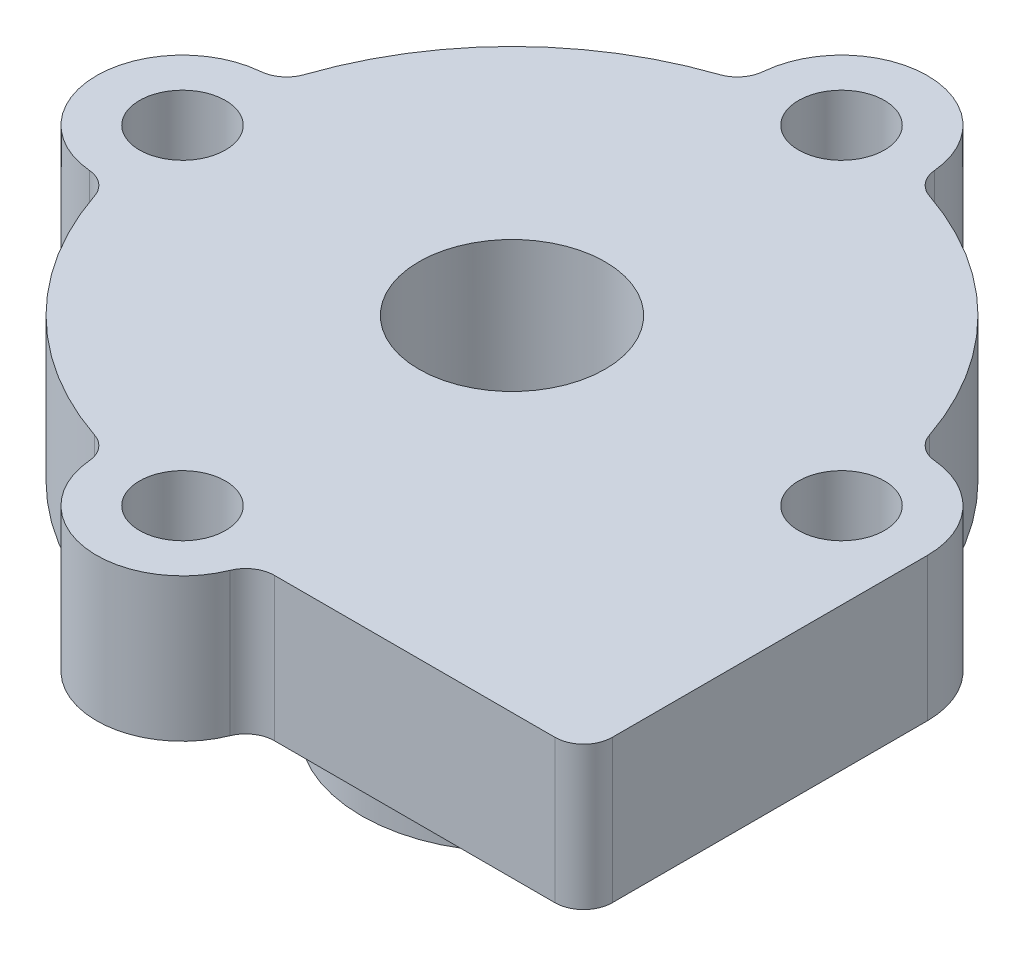
ISO-10303-21;
HEADER;
FILE_DESCRIPTION(('STEP AP214'),'2;1');
FILE_NAME('part.step','',(''),(''),'','','');
FILE_SCHEMA(('AUTOMOTIVE_DESIGN { 1 0 10303 214 1 1 1 1 }'));
ENDSEC;
DATA;
#1=APPLICATION_CONTEXT('core data for automotive mechanical design processes');
#2=APPLICATION_PROTOCOL_DEFINITION('international standard','automotive_design',2000,#1);
#3=PRODUCT_CONTEXT('',#1,'mechanical');
#4=PRODUCT('Part','Part','',(#3));
#5=PRODUCT_RELATED_PRODUCT_CATEGORY('part','',(#4));
#6=PRODUCT_DEFINITION_FORMATION('','',#4);
#7=PRODUCT_DEFINITION_CONTEXT('part definition',#1,'design');
#8=PRODUCT_DEFINITION('design','',#6,#7);
#9=PRODUCT_DEFINITION_SHAPE('','',#8);
#10=(LENGTH_UNIT() NAMED_UNIT(*) SI_UNIT(.MILLI.,.METRE.));
#11=(NAMED_UNIT(*) PLANE_ANGLE_UNIT() SI_UNIT($,.RADIAN.));
#12=(NAMED_UNIT(*) SI_UNIT($,.STERADIAN.) SOLID_ANGLE_UNIT());
#13=UNCERTAINTY_MEASURE_WITH_UNIT(LENGTH_MEASURE(1.E-05),#10,'distance_accuracy_value','');
#14=(GEOMETRIC_REPRESENTATION_CONTEXT(3) GLOBAL_UNCERTAINTY_ASSIGNED_CONTEXT((#13)) GLOBAL_UNIT_ASSIGNED_CONTEXT((#10,
#11,#12)) REPRESENTATION_CONTEXT('',''));
#15=CARTESIAN_POINT('',(0.,0.,0.));
#16=DIRECTION('',(0.,0.,1.));
#17=DIRECTION('',(1.,0.,0.));
#18=AXIS2_PLACEMENT_3D('',#15,#16,#17);
#19=CARTESIAN_POINT('',(0.,0.,0.));
#20=DIRECTION('',(0.,1.,0.));
#21=DIRECTION('',(0.,0.,1.));
#22=AXIS2_PLACEMENT_3D('',#19,#20,#21);
#23=PLANE('',#22);
#24=CARTESIAN_POINT('',(0.,0.,0.));
#25=DIRECTION('',(0.,1.,0.));
#26=DIRECTION('',(0.,0.,1.));
#27=AXIS2_PLACEMENT_3D('',#24,#25,#26);
#28=CIRCLE('',#27,6.25);
#29=CARTESIAN_POINT('',(0.,0.,6.25));
#30=VERTEX_POINT('',#29);
#31=EDGE_CURVE('E233',#30,#30,#28,.T.);
#32=ORIENTED_EDGE('',*,*,#31,.T.);
#33=EDGE_LOOP('',(#32));
#34=FACE_BOUND('',#33,.T.);
#35=CARTESIAN_POINT('',(0.,0.,-11.5));
#36=DIRECTION('',(0.,1.,0.));
#37=DIRECTION('',(0.,0.,1.));
#38=AXIS2_PLACEMENT_3D('',#35,#36,#37);
#39=CIRCLE('',#38,1.5);
#40=CARTESIAN_POINT('',(0.,0.,-10.));
#41=VERTEX_POINT('',#40);
#42=EDGE_CURVE('E194',#41,#41,#39,.T.);
#43=ORIENTED_EDGE('',*,*,#42,.T.);
#44=EDGE_LOOP('',(#43));
#45=FACE_BOUND('',#44,.T.);
#46=DIRECTION('',(0.,0.,-1.));
#47=VECTOR('',#46,1.);
#48=CARTESIAN_POINT('',(14.5,0.,12.));
#49=LINE('',#48,#47);
#50=CARTESIAN_POINT('',(14.5,0.,11.));
#51=VERTEX_POINT('',#50);
#52=CARTESIAN_POINT('',(14.5,0.,0.));
#53=VERTEX_POINT('',#52);
#54=EDGE_CURVE('E153',#51,#53,#49,.T.);
#55=ORIENTED_EDGE('',*,*,#54,.F.);
#56=CARTESIAN_POINT('',(13.5,0.,11.));
#57=DIRECTION('',(0.,1.,0.));
#58=DIRECTION('',(0.,0.,1.));
#59=AXIS2_PLACEMENT_3D('',#56,#57,#58);
#60=CIRCLE('',#59,1.);
#61=CARTESIAN_POINT('',(13.5,0.,12.));
#62=VERTEX_POINT('',#61);
#63=EDGE_CURVE('E231',#51,#62,#60,.F.);
#64=ORIENTED_EDGE('',*,*,#63,.T.);
#65=DIRECTION('',(1.,0.,0.));
#66=VECTOR('',#65,1.);
#67=CARTESIAN_POINT('',(0.,0.,12.));
#68=LINE('',#67,#66);
#69=CARTESIAN_POINT('',(3.70809924354783,0.,12.));
#70=VERTEX_POINT('',#69);
#71=EDGE_CURVE('E163',#70,#62,#68,.T.);
#72=ORIENTED_EDGE('',*,*,#71,.F.);
#73=CARTESIAN_POINT('',(3.70809924354783,0.,13.));
#74=DIRECTION('',(0.,1.,0.));
#75=DIRECTION('',(0.,0.,1.));
#76=AXIS2_PLACEMENT_3D('',#73,#74,#75);
#77=CIRCLE('',#76,1.);
#78=CARTESIAN_POINT('',(2.78107443266087,0.,12.625));
#79=VERTEX_POINT('',#78);
#80=EDGE_CURVE('E265',#70,#79,#77,.T.);
#81=ORIENTED_EDGE('',*,*,#80,.T.);
#82=CARTESIAN_POINT('',(0.,0.,11.5));
#83=DIRECTION('',(0.,1.,0.));
#84=DIRECTION('',(0.,0.,-1.));
#85=AXIS2_PLACEMENT_3D('',#82,#83,#84);
#86=CIRCLE('',#85,3.);
#87=CARTESIAN_POINT('',(-2.98863632279729,0.,11.7608695652174));
#88=VERTEX_POINT('',#87);
#89=EDGE_CURVE('E179',#88,#79,#86,.T.);
#90=ORIENTED_EDGE('',*,*,#89,.F.);
#91=CARTESIAN_POINT('',(-3.98484843039638,0.,11.8478260869565));
#92=DIRECTION('',(0.,1.,0.));
#93=DIRECTION('',(0.,0.,1.));
#94=AXIS2_PLACEMENT_3D('',#91,#92,#93);
#95=CIRCLE('',#94,1.);
#96=CARTESIAN_POINT('',(-3.66606055596467,0.,10.9));
#97=VERTEX_POINT('',#96);
#98=EDGE_CURVE('E41',#88,#97,#95,.T.);
#99=ORIENTED_EDGE('',*,*,#98,.T.);
#100=CARTESIAN_POINT('',(0.,0.,0.));
#101=DIRECTION('',(0.,1.,0.));
#102=DIRECTION('',(0.,0.,1.));
#103=AXIS2_PLACEMENT_3D('',#100,#101,#102);
#104=CIRCLE('',#103,11.5);
#105=CARTESIAN_POINT('',(-10.9,0.,3.66606055596471));
#106=VERTEX_POINT('',#105);
#107=EDGE_CURVE('E215',#106,#97,#104,.T.);
#108=ORIENTED_EDGE('',*,*,#107,.F.);
#109=CARTESIAN_POINT('',(-11.8478260869565,0.,3.98484843039642));
#110=DIRECTION('',(0.,1.,0.));
#111=DIRECTION('',(0.,0.,1.));
#112=AXIS2_PLACEMENT_3D('',#109,#110,#111);
#113=CIRCLE('',#112,1.);
#114=CARTESIAN_POINT('',(-11.7608695652174,0.,2.98863632279733));
#115=VERTEX_POINT('',#114);
#116=EDGE_CURVE('E284',#106,#115,#113,.T.);
#117=ORIENTED_EDGE('',*,*,#116,.T.);
#118=CARTESIAN_POINT('',(-11.5,0.,0.));
#119=DIRECTION('',(0.,1.,0.));
#120=DIRECTION('',(1.,0.,0.));
#121=AXIS2_PLACEMENT_3D('',#118,#119,#120);
#122=CIRCLE('',#121,3.);
#123=CARTESIAN_POINT('',(-11.7608695652174,0.,-2.98863632279725));
#124=VERTEX_POINT('',#123);
#125=EDGE_CURVE('E185',#124,#115,#122,.T.);
#126=ORIENTED_EDGE('',*,*,#125,.F.);
#127=CARTESIAN_POINT('',(-11.8478260869565,0.,-3.98484843039634));
#128=DIRECTION('',(0.,1.,0.));
#129=DIRECTION('',(0.,0.,1.));
#130=AXIS2_PLACEMENT_3D('',#127,#128,#129);
#131=CIRCLE('',#130,1.);
#132=CARTESIAN_POINT('',(-10.9,0.,-3.66606055596463));
#133=VERTEX_POINT('',#132);
#134=EDGE_CURVE('E278',#124,#133,#131,.T.);
#135=ORIENTED_EDGE('',*,*,#134,.T.);
#136=CARTESIAN_POINT('',(-3.66606055596467,0.,-10.9));
#137=VERTEX_POINT('',#136);
#138=EDGE_CURVE('E216',#137,#133,#104,.T.);
#139=ORIENTED_EDGE('',*,*,#138,.F.);
#140=CARTESIAN_POINT('',(-3.98484843039638,0.,-11.8478260869565));
#141=DIRECTION('',(0.,1.,0.));
#142=DIRECTION('',(0.,0.,1.));
#143=AXIS2_PLACEMENT_3D('',#140,#141,#142);
#144=CIRCLE('',#143,1.);
#145=CARTESIAN_POINT('',(-2.98863632279729,0.,-11.7608695652174));
#146=VERTEX_POINT('',#145);
#147=EDGE_CURVE('E276',#137,#146,#144,.T.);
#148=ORIENTED_EDGE('',*,*,#147,.T.);
#149=CARTESIAN_POINT('',(0.,0.,-11.5));
#150=DIRECTION('',(0.,1.,0.));
#151=DIRECTION('',(0.,0.,1.));
#152=AXIS2_PLACEMENT_3D('',#149,#150,#151);
#153=CIRCLE('',#152,3.);
#154=CARTESIAN_POINT('',(2.98863632279729,0.,-11.7608695652174));
#155=VERTEX_POINT('',#154);
#156=EDGE_CURVE('E197',#155,#146,#153,.T.);
#157=ORIENTED_EDGE('',*,*,#156,.F.);
#158=CARTESIAN_POINT('',(3.98484843039638,0.,-11.8478260869565));
#159=DIRECTION('',(0.,1.,0.));
#160=DIRECTION('',(0.,0.,1.));
#161=AXIS2_PLACEMENT_3D('',#158,#159,#160);
#162=CIRCLE('',#161,1.);
#163=CARTESIAN_POINT('',(3.66606055596467,0.,-10.9));
#164=VERTEX_POINT('',#163);
#165=EDGE_CURVE('E270',#155,#164,#162,.T.);
#166=ORIENTED_EDGE('',*,*,#165,.T.);
#167=CARTESIAN_POINT('',(10.9,0.,-3.66606055596479));
#168=VERTEX_POINT('',#167);
#169=EDGE_CURVE('E208',#168,#164,#104,.T.);
#170=ORIENTED_EDGE('',*,*,#169,.F.);
#171=CARTESIAN_POINT('',(11.8478260869565,0.,-3.98484843039651));
#172=DIRECTION('',(0.,1.,0.));
#173=DIRECTION('',(0.,0.,1.));
#174=AXIS2_PLACEMENT_3D('',#171,#172,#173);
#175=CIRCLE('',#174,1.);
#176=CARTESIAN_POINT('',(11.7608695652174,0.,-2.98863632279741));
#177=VERTEX_POINT('',#176);
#178=EDGE_CURVE('E177',#168,#177,#175,.T.);
#179=ORIENTED_EDGE('',*,*,#178,.T.);
#180=CARTESIAN_POINT('',(11.5,0.,-1.20456106190088E-13));
#181=DIRECTION('',(0.,1.,0.));
#182=DIRECTION('',(-1.,0.,0.));
#183=AXIS2_PLACEMENT_3D('',#180,#181,#182);
#184=CIRCLE('',#183,3.);
#185=EDGE_CURVE('E169',#53,#177,#184,.T.);
#186=ORIENTED_EDGE('',*,*,#185,.F.);
#187=EDGE_LOOP('',(#55,#64,#72,#81,#90,#99,#108,#117,#126,#135,#139,#148,#157,#166,#170,#179,#186));
#188=FACE_BOUND('',#187,.T.);
#189=CARTESIAN_POINT('',(-11.5,0.,0.));
#190=DIRECTION('',(0.,1.,0.));
#191=DIRECTION('',(1.,0.,0.));
#192=AXIS2_PLACEMENT_3D('',#189,#190,#191);
#193=CIRCLE('',#192,1.5);
#194=CARTESIAN_POINT('',(-10.,0.,0.));
#195=VERTEX_POINT('',#194);
#196=EDGE_CURVE('E312',#195,#195,#193,.T.);
#197=ORIENTED_EDGE('',*,*,#196,.T.);
#198=EDGE_LOOP('',(#197));
#199=FACE_BOUND('',#198,.T.);
#200=CARTESIAN_POINT('',(0.,0.,11.5));
#201=DIRECTION('',(0.,1.,0.));
#202=DIRECTION('',(0.,0.,-1.));
#203=AXIS2_PLACEMENT_3D('',#200,#201,#202);
#204=CIRCLE('',#203,1.5);
#205=CARTESIAN_POINT('',(0.,0.,10.));
#206=VERTEX_POINT('',#205);
#207=EDGE_CURVE('E321',#206,#206,#204,.T.);
#208=ORIENTED_EDGE('',*,*,#207,.T.);
#209=EDGE_LOOP('',(#208));
#210=FACE_BOUND('',#209,.T.);
#211=CARTESIAN_POINT('',(11.5,0.,-1.20456106190088E-13));
#212=DIRECTION('',(0.,1.,0.));
#213=DIRECTION('',(-1.,0.,0.));
#214=AXIS2_PLACEMENT_3D('',#211,#212,#213);
#215=CIRCLE('',#214,1.5);
#216=CARTESIAN_POINT('',(10.,0.,-1.04744440165294E-13));
#217=VERTEX_POINT('',#216);
#218=EDGE_CURVE('E326',#217,#217,#215,.T.);
#219=ORIENTED_EDGE('',*,*,#218,.T.);
#220=EDGE_LOOP('',(#219));
#221=FACE_BOUND('',#220,.T.);
#222=ADVANCED_FACE('F33',(#34,#45,#188,#199,#210,#221),#23,.F.);
#223=CARTESIAN_POINT('',(0.,5.,0.));
#224=DIRECTION('',(0.,-1.,0.));
#225=DIRECTION('',(0.,0.,-1.));
#226=AXIS2_PLACEMENT_3D('',#223,#224,#225);
#227=CYLINDRICAL_SURFACE('',#226,11.5);
#228=CARTESIAN_POINT('',(0.,5.,0.));
#229=DIRECTION('',(0.,1.,0.));
#230=DIRECTION('',(0.,0.,1.));
#231=AXIS2_PLACEMENT_3D('',#228,#229,#230);
#232=CIRCLE('',#231,11.5);
#233=CARTESIAN_POINT('',(10.9,5.,-3.66606055596479));
#234=VERTEX_POINT('',#233);
#235=CARTESIAN_POINT('',(3.66606055596467,5.,-10.9));
#236=VERTEX_POINT('',#235);
#237=EDGE_CURVE('E212',#234,#236,#232,.T.);
#238=ORIENTED_EDGE('',*,*,#237,.F.);
#239=DIRECTION('',(0.,-1.,0.));
#240=VECTOR('',#239,1.);
#241=CARTESIAN_POINT('',(10.9,5.,-3.66606055596479));
#242=LINE('',#241,#240);
#243=EDGE_CURVE('E240',#234,#168,#242,.T.);
#244=ORIENTED_EDGE('',*,*,#243,.T.);
#245=ORIENTED_EDGE('',*,*,#169,.T.);
#246=DIRECTION('',(0.,-1.,0.));
#247=VECTOR('',#246,1.);
#248=CARTESIAN_POINT('',(3.66606055596467,5.,-10.9));
#249=LINE('',#248,#247);
#250=EDGE_CURVE('E238',#164,#236,#249,.F.);
#251=ORIENTED_EDGE('',*,*,#250,.T.);
#252=EDGE_LOOP('',(#238,#244,#245,#251));
#253=FACE_BOUND('',#252,.T.);
#254=ADVANCED_FACE('F359',(#253),#227,.T.);
#255=CARTESIAN_POINT('',(-10.9,5.,3.66606055596471));
#256=VERTEX_POINT('',#255);
#257=CARTESIAN_POINT('',(-3.66606055596467,5.,10.9));
#258=VERTEX_POINT('',#257);
#259=EDGE_CURVE('E209',#256,#258,#232,.T.);
#260=ORIENTED_EDGE('',*,*,#259,.F.);
#261=DIRECTION('',(0.,-1.,0.));
#262=VECTOR('',#261,1.);
#263=CARTESIAN_POINT('',(-10.9,5.,3.66606055596471));
#264=LINE('',#263,#262);
#265=EDGE_CURVE('E259',#256,#106,#264,.T.);
#266=ORIENTED_EDGE('',*,*,#265,.T.);
#267=ORIENTED_EDGE('',*,*,#107,.T.);
#268=DIRECTION('',(0.,-1.,0.));
#269=VECTOR('',#268,1.);
#270=CARTESIAN_POINT('',(-3.66606055596467,5.,10.9));
#271=LINE('',#270,#269);
#272=EDGE_CURVE('E56',#97,#258,#271,.F.);
#273=ORIENTED_EDGE('',*,*,#272,.T.);
#274=EDGE_LOOP('',(#260,#266,#267,#273));
#275=FACE_BOUND('',#274,.T.);
#276=ADVANCED_FACE('F290',(#275),#227,.T.);
#277=CARTESIAN_POINT('',(-3.66606055596467,5.,-10.9));
#278=VERTEX_POINT('',#277);
#279=CARTESIAN_POINT('',(-10.9,5.,-3.66606055596463));
#280=VERTEX_POINT('',#279);
#281=EDGE_CURVE('E211',#278,#280,#232,.T.);
#282=ORIENTED_EDGE('',*,*,#281,.F.);
#283=DIRECTION('',(0.,-1.,0.));
#284=VECTOR('',#283,1.);
#285=CARTESIAN_POINT('',(-3.66606055596467,5.,-10.9));
#286=LINE('',#285,#284);
#287=EDGE_CURVE('E250',#278,#137,#286,.T.);
#288=ORIENTED_EDGE('',*,*,#287,.T.);
#289=ORIENTED_EDGE('',*,*,#138,.T.);
#290=DIRECTION('',(0.,-1.,0.));
#291=VECTOR('',#290,1.);
#292=CARTESIAN_POINT('',(-10.9,5.,-3.66606055596463));
#293=LINE('',#292,#291);
#294=EDGE_CURVE('E248',#133,#280,#293,.F.);
#295=ORIENTED_EDGE('',*,*,#294,.T.);
#296=EDGE_LOOP('',(#282,#288,#289,#295));
#297=FACE_BOUND('',#296,.T.);
#298=ADVANCED_FACE('F367',(#297),#227,.T.);
#299=CARTESIAN_POINT('',(0.,5.,0.));
#300=DIRECTION('',(0.,1.,0.));
#301=DIRECTION('',(0.,0.,1.));
#302=AXIS2_PLACEMENT_3D('',#299,#300,#301);
#303=PLANE('',#302);
#304=CARTESIAN_POINT('',(11.5,5.,-1.20456106190088E-13));
#305=DIRECTION('',(0.,1.,0.));
#306=DIRECTION('',(-1.,0.,0.));
#307=AXIS2_PLACEMENT_3D('',#304,#305,#306);
#308=CIRCLE('',#307,1.5);
#309=CARTESIAN_POINT('',(10.,5.,-1.04744440165294E-13));
#310=VERTEX_POINT('',#309);
#311=EDGE_CURVE('E329',#310,#310,#308,.T.);
#312=ORIENTED_EDGE('',*,*,#311,.F.);
#313=EDGE_LOOP('',(#312));
#314=FACE_BOUND('',#313,.T.);
#315=CARTESIAN_POINT('',(0.,5.,11.5));
#316=DIRECTION('',(0.,1.,0.));
#317=DIRECTION('',(0.,0.,-1.));
#318=AXIS2_PLACEMENT_3D('',#315,#316,#317);
#319=CIRCLE('',#318,1.5);
#320=CARTESIAN_POINT('',(0.,5.,10.));
#321=VERTEX_POINT('',#320);
#322=EDGE_CURVE('E323',#321,#321,#319,.T.);
#323=ORIENTED_EDGE('',*,*,#322,.F.);
#324=EDGE_LOOP('',(#323));
#325=FACE_BOUND('',#324,.T.);
#326=CARTESIAN_POINT('',(-11.5,5.,0.));
#327=DIRECTION('',(0.,1.,0.));
#328=DIRECTION('',(1.,0.,0.));
#329=AXIS2_PLACEMENT_3D('',#326,#327,#328);
#330=CIRCLE('',#329,1.5);
#331=CARTESIAN_POINT('',(-10.,5.,0.));
#332=VERTEX_POINT('',#331);
#333=EDGE_CURVE('E316',#332,#332,#330,.T.);
#334=ORIENTED_EDGE('',*,*,#333,.F.);
#335=EDGE_LOOP('',(#334));
#336=FACE_BOUND('',#335,.T.);
#337=DIRECTION('',(1.,0.,0.));
#338=VECTOR('',#337,1.);
#339=CARTESIAN_POINT('',(0.,5.,12.));
#340=LINE('',#339,#338);
#341=CARTESIAN_POINT('',(3.70809924354783,5.,12.));
#342=VERTEX_POINT('',#341);
#343=CARTESIAN_POINT('',(13.5,5.,12.));
#344=VERTEX_POINT('',#343);
#345=EDGE_CURVE('E305',#342,#344,#340,.T.);
#346=ORIENTED_EDGE('',*,*,#345,.T.);
#347=CARTESIAN_POINT('',(13.5,5.,11.));
#348=DIRECTION('',(0.,1.,0.));
#349=DIRECTION('',(0.,0.,1.));
#350=AXIS2_PLACEMENT_3D('',#347,#348,#349);
#351=CIRCLE('',#350,1.);
#352=CARTESIAN_POINT('',(14.5,5.,11.));
#353=VERTEX_POINT('',#352);
#354=EDGE_CURVE('E48',#344,#353,#351,.T.);
#355=ORIENTED_EDGE('',*,*,#354,.T.);
#356=DIRECTION('',(0.,0.,-1.));
#357=VECTOR('',#356,1.);
#358=CARTESIAN_POINT('',(14.5,5.,12.));
#359=LINE('',#358,#357);
#360=CARTESIAN_POINT('',(14.5,5.,0.));
#361=VERTEX_POINT('',#360);
#362=EDGE_CURVE('E311',#353,#361,#359,.T.);
#363=ORIENTED_EDGE('',*,*,#362,.T.);
#364=CARTESIAN_POINT('',(11.5,5.,-1.20456106190088E-13));
#365=DIRECTION('',(0.,1.,0.));
#366=DIRECTION('',(-1.,0.,0.));
#367=AXIS2_PLACEMENT_3D('',#364,#365,#366);
#368=CIRCLE('',#367,3.);
#369=CARTESIAN_POINT('',(11.7608695652174,5.,-2.98863632279741));
#370=VERTEX_POINT('',#369);
#371=EDGE_CURVE('E172',#361,#370,#368,.T.);
#372=ORIENTED_EDGE('',*,*,#371,.T.);
#373=CARTESIAN_POINT('',(11.8478260869565,5.,-3.98484843039651));
#374=DIRECTION('',(0.,1.,0.));
#375=DIRECTION('',(0.,0.,1.));
#376=AXIS2_PLACEMENT_3D('',#373,#374,#375);
#377=CIRCLE('',#376,1.);
#378=EDGE_CURVE('E267',#370,#234,#377,.F.);
#379=ORIENTED_EDGE('',*,*,#378,.T.);
#380=ORIENTED_EDGE('',*,*,#237,.T.);
#381=CARTESIAN_POINT('',(3.98484843039638,5.,-11.8478260869565));
#382=DIRECTION('',(0.,1.,0.));
#383=DIRECTION('',(0.,0.,1.));
#384=AXIS2_PLACEMENT_3D('',#381,#382,#383);
#385=CIRCLE('',#384,1.);
#386=CARTESIAN_POINT('',(2.98863632279729,5.,-11.7608695652174));
#387=VERTEX_POINT('',#386);
#388=EDGE_CURVE('E272',#236,#387,#385,.F.);
#389=ORIENTED_EDGE('',*,*,#388,.T.);
#390=CARTESIAN_POINT('',(0.,5.,-11.5));
#391=DIRECTION('',(0.,1.,0.));
#392=DIRECTION('',(0.,0.,1.));
#393=AXIS2_PLACEMENT_3D('',#390,#391,#392);
#394=CIRCLE('',#393,3.);
#395=CARTESIAN_POINT('',(-2.98863632279729,5.,-11.7608695652174));
#396=VERTEX_POINT('',#395);
#397=EDGE_CURVE('E200',#387,#396,#394,.T.);
#398=ORIENTED_EDGE('',*,*,#397,.T.);
#399=CARTESIAN_POINT('',(-3.98484843039638,5.,-11.8478260869565));
#400=DIRECTION('',(0.,1.,0.));
#401=DIRECTION('',(0.,0.,1.));
#402=AXIS2_PLACEMENT_3D('',#399,#400,#401);
#403=CIRCLE('',#402,1.);
#404=EDGE_CURVE('E274',#396,#278,#403,.F.);
#405=ORIENTED_EDGE('',*,*,#404,.T.);
#406=ORIENTED_EDGE('',*,*,#281,.T.);
#407=CARTESIAN_POINT('',(-11.8478260869565,5.,-3.98484843039634));
#408=DIRECTION('',(0.,1.,0.));
#409=DIRECTION('',(0.,0.,1.));
#410=AXIS2_PLACEMENT_3D('',#407,#408,#409);
#411=CIRCLE('',#410,1.);
#412=CARTESIAN_POINT('',(-11.7608695652174,5.,-2.98863632279725));
#413=VERTEX_POINT('',#412);
#414=EDGE_CURVE('E280',#280,#413,#411,.F.);
#415=ORIENTED_EDGE('',*,*,#414,.T.);
#416=CARTESIAN_POINT('',(-11.5,5.,0.));
#417=DIRECTION('',(0.,1.,0.));
#418=DIRECTION('',(1.,0.,0.));
#419=AXIS2_PLACEMENT_3D('',#416,#417,#418);
#420=CIRCLE('',#419,3.);
#421=CARTESIAN_POINT('',(-11.7608695652174,5.,2.98863632279733));
#422=VERTEX_POINT('',#421);
#423=EDGE_CURVE('E188',#413,#422,#420,.T.);
#424=ORIENTED_EDGE('',*,*,#423,.T.);
#425=CARTESIAN_POINT('',(-11.8478260869565,5.,3.98484843039642));
#426=DIRECTION('',(0.,1.,0.));
#427=DIRECTION('',(0.,0.,1.));
#428=AXIS2_PLACEMENT_3D('',#425,#426,#427);
#429=CIRCLE('',#428,1.);
#430=EDGE_CURVE('E282',#422,#256,#429,.F.);
#431=ORIENTED_EDGE('',*,*,#430,.T.);
#432=ORIENTED_EDGE('',*,*,#259,.T.);
#433=CARTESIAN_POINT('',(-3.98484843039638,5.,11.8478260869565));
#434=DIRECTION('',(0.,1.,0.));
#435=DIRECTION('',(0.,0.,1.));
#436=AXIS2_PLACEMENT_3D('',#433,#434,#435);
#437=CIRCLE('',#436,1.);
#438=CARTESIAN_POINT('',(-2.98863632279729,5.,11.7608695652174));
#439=VERTEX_POINT('',#438);
#440=EDGE_CURVE('E11',#258,#439,#437,.F.);
#441=ORIENTED_EDGE('',*,*,#440,.T.);
#442=CARTESIAN_POINT('',(0.,5.,11.5));
#443=DIRECTION('',(0.,1.,0.));
#444=DIRECTION('',(0.,0.,-1.));
#445=AXIS2_PLACEMENT_3D('',#442,#443,#444);
#446=CIRCLE('',#445,3.);
#447=CARTESIAN_POINT('',(2.78107443266087,5.,12.625));
#448=VERTEX_POINT('',#447);
#449=EDGE_CURVE('E182',#439,#448,#446,.T.);
#450=ORIENTED_EDGE('',*,*,#449,.T.);
#451=CARTESIAN_POINT('',(3.70809924354783,5.,13.));
#452=DIRECTION('',(0.,1.,0.));
#453=DIRECTION('',(0.,0.,1.));
#454=AXIS2_PLACEMENT_3D('',#451,#452,#453);
#455=CIRCLE('',#454,1.);
#456=EDGE_CURVE('E263',#448,#342,#455,.F.);
#457=ORIENTED_EDGE('',*,*,#456,.T.);
#458=EDGE_LOOP('',(#346,#355,#363,#372,#379,#380,#389,#398,#405,#406,#415,#424,#431,#432,#441,
#450,#457));
#459=FACE_BOUND('',#458,.T.);
#460=CARTESIAN_POINT('',(0.,5.,-11.5));
#461=DIRECTION('',(0.,1.,0.));
#462=DIRECTION('',(0.,0.,1.));
#463=AXIS2_PLACEMENT_3D('',#460,#461,#462);
#464=CIRCLE('',#463,1.5);
#465=CARTESIAN_POINT('',(0.,5.,-10.));
#466=VERTEX_POINT('',#465);
#467=EDGE_CURVE('E191',#466,#466,#464,.T.);
#468=ORIENTED_EDGE('',*,*,#467,.F.);
#469=EDGE_LOOP('',(#468));
#470=FACE_BOUND('',#469,.T.);
#471=CARTESIAN_POINT('',(0.,5.,0.));
#472=DIRECTION('',(0.,1.,0.));
#473=DIRECTION('',(0.,0.,1.));
#474=AXIS2_PLACEMENT_3D('',#471,#472,#473);
#475=CIRCLE('',#474,3.25);
#476=CARTESIAN_POINT('',(0.,5.,3.25));
#477=VERTEX_POINT('',#476);
#478=EDGE_CURVE('E203',#477,#477,#475,.T.);
#479=ORIENTED_EDGE('',*,*,#478,.F.);
#480=EDGE_LOOP('',(#479));
#481=FACE_BOUND('',#480,.T.);
#482=ADVANCED_FACE('F295',(#314,#325,#336,#459,#470,#481),#303,.T.);
#483=CARTESIAN_POINT('',(0.,5.,0.));
#484=DIRECTION('',(0.,-1.,0.));
#485=DIRECTION('',(0.,0.,-1.));
#486=AXIS2_PLACEMENT_3D('',#483,#484,#485);
#487=CYLINDRICAL_SURFACE('',#486,3.25);
#488=ORIENTED_EDGE('',*,*,#478,.T.);
#489=EDGE_LOOP('',(#488));
#490=FACE_BOUND('',#489,.T.);
#491=CARTESIAN_POINT('',(0.,-7.5,0.));
#492=DIRECTION('',(0.,-1.,0.));
#493=DIRECTION('',(0.,0.,-1.));
#494=AXIS2_PLACEMENT_3D('',#491,#492,#493);
#495=CIRCLE('',#494,3.25);
#496=CARTESIAN_POINT('',(0.,-7.5,-3.25));
#497=VERTEX_POINT('',#496);
#498=EDGE_CURVE('E337',#497,#497,#495,.T.);
#499=ORIENTED_EDGE('',*,*,#498,.T.);
#500=EDGE_LOOP('',(#499));
#501=FACE_BOUND('',#500,.T.);
#502=ADVANCED_FACE('F341',(#490,#501),#487,.F.);
#503=CARTESIAN_POINT('',(0.,5.,-11.5));
#504=DIRECTION('',(0.,-1.,0.));
#505=DIRECTION('',(0.,0.,-1.));
#506=AXIS2_PLACEMENT_3D('',#503,#504,#505);
#507=CYLINDRICAL_SURFACE('',#506,3.);
#508=ORIENTED_EDGE('',*,*,#397,.F.);
#509=DIRECTION('',(0.,-1.,0.));
#510=VECTOR('',#509,1.);
#511=CARTESIAN_POINT('',(2.98863632279729,5.,-11.7608695652174));
#512=LINE('',#511,#510);
#513=EDGE_CURVE('E245',#387,#155,#512,.T.);
#514=ORIENTED_EDGE('',*,*,#513,.T.);
#515=ORIENTED_EDGE('',*,*,#156,.T.);
#516=DIRECTION('',(0.,-1.,0.));
#517=VECTOR('',#516,1.);
#518=CARTESIAN_POINT('',(-2.98863632279729,5.,-11.7608695652174));
#519=LINE('',#518,#517);
#520=EDGE_CURVE('E242',#146,#396,#519,.F.);
#521=ORIENTED_EDGE('',*,*,#520,.T.);
#522=EDGE_LOOP('',(#508,#514,#515,#521));
#523=FACE_BOUND('',#522,.T.);
#524=ADVANCED_FACE('F514',(#523),#507,.T.);
#525=CARTESIAN_POINT('',(0.,0.,-11.5));
#526=DIRECTION('',(0.,1.,0.));
#527=DIRECTION('',(0.,0.,1.));
#528=AXIS2_PLACEMENT_3D('',#525,#526,#527);
#529=CYLINDRICAL_SURFACE('',#528,1.5);
#530=ORIENTED_EDGE('',*,*,#42,.F.);
#531=EDGE_LOOP('',(#530));
#532=FACE_BOUND('',#531,.T.);
#533=ORIENTED_EDGE('',*,*,#467,.T.);
#534=EDGE_LOOP('',(#533));
#535=FACE_BOUND('',#534,.T.);
#536=ADVANCED_FACE('F506',(#532,#535),#529,.F.);
#537=CARTESIAN_POINT('',(-11.5,5.,0.));
#538=DIRECTION('',(0.,-1.,0.));
#539=DIRECTION('',(0.,0.,-1.));
#540=AXIS2_PLACEMENT_3D('',#537,#538,#539);
#541=CYLINDRICAL_SURFACE('',#540,3.);
#542=ORIENTED_EDGE('',*,*,#423,.F.);
#543=DIRECTION('',(0.,-1.,0.));
#544=VECTOR('',#543,1.);
#545=CARTESIAN_POINT('',(-11.7608695652174,5.,-2.98863632279725));
#546=LINE('',#545,#544);
#547=EDGE_CURVE('E255',#413,#124,#546,.T.);
#548=ORIENTED_EDGE('',*,*,#547,.T.);
#549=ORIENTED_EDGE('',*,*,#125,.T.);
#550=DIRECTION('',(0.,-1.,0.));
#551=VECTOR('',#550,1.);
#552=CARTESIAN_POINT('',(-11.7608695652174,5.,2.98863632279733));
#553=LINE('',#552,#551);
#554=EDGE_CURVE('E252',#115,#422,#553,.F.);
#555=ORIENTED_EDGE('',*,*,#554,.T.);
#556=EDGE_LOOP('',(#542,#548,#549,#555));
#557=FACE_BOUND('',#556,.T.);
#558=ADVANCED_FACE('F497',(#557),#541,.T.);
#559=CARTESIAN_POINT('',(0.,5.,11.5));
#560=DIRECTION('',(0.,-1.,0.));
#561=DIRECTION('',(0.,0.,-1.));
#562=AXIS2_PLACEMENT_3D('',#559,#560,#561);
#563=CYLINDRICAL_SURFACE('',#562,3.);
#564=ORIENTED_EDGE('',*,*,#89,.T.);
#565=DIRECTION('',(0.,-1.,0.));
#566=VECTOR('',#565,1.);
#567=CARTESIAN_POINT('',(2.78107443266087,5.,12.625));
#568=LINE('',#567,#566);
#569=EDGE_CURVE('E220',#79,#448,#568,.F.);
#570=ORIENTED_EDGE('',*,*,#569,.T.);
#571=ORIENTED_EDGE('',*,*,#449,.F.);
#572=DIRECTION('',(0.,-1.,0.));
#573=VECTOR('',#572,1.);
#574=CARTESIAN_POINT('',(-2.98863632279729,5.,11.7608695652174));
#575=LINE('',#574,#573);
#576=EDGE_CURVE('E217',#439,#88,#575,.T.);
#577=ORIENTED_EDGE('',*,*,#576,.T.);
#578=EDGE_LOOP('',(#564,#570,#571,#577));
#579=FACE_BOUND('',#578,.T.);
#580=ADVANCED_FACE('F298',(#579),#563,.T.);
#581=CARTESIAN_POINT('',(11.5,5.,-1.20456106190088E-13));
#582=DIRECTION('',(0.,-1.,0.));
#583=DIRECTION('',(0.,0.,-1.));
#584=AXIS2_PLACEMENT_3D('',#581,#582,#583);
#585=CYLINDRICAL_SURFACE('',#584,3.);
#586=ORIENTED_EDGE('',*,*,#185,.T.);
#587=DIRECTION('',(0.,-1.,0.));
#588=VECTOR('',#587,1.);
#589=CARTESIAN_POINT('',(11.7608695652174,5.,-2.98863632279741));
#590=LINE('',#589,#588);
#591=EDGE_CURVE('E236',#177,#370,#590,.F.);
#592=ORIENTED_EDGE('',*,*,#591,.T.);
#593=ORIENTED_EDGE('',*,*,#371,.F.);
#594=DIRECTION('',(0.,1.,0.));
#595=VECTOR('',#594,1.);
#596=CARTESIAN_POINT('',(14.5,0.,0.));
#597=LINE('',#596,#595);
#598=EDGE_CURVE('E156',#53,#361,#597,.T.);
#599=ORIENTED_EDGE('',*,*,#598,.F.);
#600=EDGE_LOOP('',(#586,#592,#593,#599));
#601=FACE_BOUND('',#600,.T.);
#602=ADVANCED_FACE('F167',(#601),#585,.T.);
#603=CARTESIAN_POINT('',(0.,0.,12.));
#604=DIRECTION('',(0.,0.,1.));
#605=DIRECTION('',(1.,0.,0.));
#606=AXIS2_PLACEMENT_3D('',#603,#604,#605);
#607=PLANE('',#606);
#608=ORIENTED_EDGE('',*,*,#345,.F.);
#609=DIRECTION('',(0.,-1.,0.));
#610=VECTOR('',#609,1.);
#611=CARTESIAN_POINT('',(3.70809924354783,0.,12.));
#612=LINE('',#611,#610);
#613=EDGE_CURVE('E226',#342,#70,#612,.T.);
#614=ORIENTED_EDGE('',*,*,#613,.T.);
#615=ORIENTED_EDGE('',*,*,#71,.T.);
#616=DIRECTION('',(0.,1.,0.));
#617=VECTOR('',#616,1.);
#618=CARTESIAN_POINT('',(13.5,0.,12.));
#619=LINE('',#618,#617);
#620=EDGE_CURVE('E223',#62,#344,#619,.T.);
#621=ORIENTED_EDGE('',*,*,#620,.T.);
#622=EDGE_LOOP('',(#608,#614,#615,#621));
#623=FACE_BOUND('',#622,.T.);
#624=ADVANCED_FACE('F307',(#623),#607,.T.);
#625=CARTESIAN_POINT('',(14.5,0.,12.));
#626=DIRECTION('',(1.,0.,0.));
#627=DIRECTION('',(0.,0.,-1.));
#628=AXIS2_PLACEMENT_3D('',#625,#626,#627);
#629=PLANE('',#628);
#630=ORIENTED_EDGE('',*,*,#362,.F.);
#631=DIRECTION('',(0.,1.,0.));
#632=VECTOR('',#631,1.);
#633=CARTESIAN_POINT('',(14.5,0.,11.));
#634=LINE('',#633,#632);
#635=EDGE_CURVE('E159',#353,#51,#634,.F.);
#636=ORIENTED_EDGE('',*,*,#635,.T.);
#637=ORIENTED_EDGE('',*,*,#54,.T.);
#638=ORIENTED_EDGE('',*,*,#598,.T.);
#639=EDGE_LOOP('',(#630,#636,#637,#638));
#640=FACE_BOUND('',#639,.T.);
#641=ADVANCED_FACE('F155',(#640),#629,.T.);
#642=CARTESIAN_POINT('',(-11.5,0.,0.));
#643=DIRECTION('',(0.,1.,0.));
#644=DIRECTION('',(0.,0.,1.));
#645=AXIS2_PLACEMENT_3D('',#642,#643,#644);
#646=CYLINDRICAL_SURFACE('',#645,1.5);
#647=ORIENTED_EDGE('',*,*,#196,.F.);
#648=EDGE_LOOP('',(#647));
#649=FACE_BOUND('',#648,.T.);
#650=ORIENTED_EDGE('',*,*,#333,.T.);
#651=EDGE_LOOP('',(#650));
#652=FACE_BOUND('',#651,.T.);
#653=ADVANCED_FACE('F469',(#649,#652),#646,.F.);
#654=CARTESIAN_POINT('',(0.,0.,11.5));
#655=DIRECTION('',(0.,1.,0.));
#656=DIRECTION('',(0.,0.,1.));
#657=AXIS2_PLACEMENT_3D('',#654,#655,#656);
#658=CYLINDRICAL_SURFACE('',#657,1.5);
#659=ORIENTED_EDGE('',*,*,#207,.F.);
#660=EDGE_LOOP('',(#659));
#661=FACE_BOUND('',#660,.T.);
#662=ORIENTED_EDGE('',*,*,#322,.T.);
#663=EDGE_LOOP('',(#662));
#664=FACE_BOUND('',#663,.T.);
#665=ADVANCED_FACE('F355',(#661,#664),#658,.F.);
#666=CARTESIAN_POINT('',(11.5,0.,-1.20456106190088E-13));
#667=DIRECTION('',(0.,1.,0.));
#668=DIRECTION('',(0.,0.,1.));
#669=AXIS2_PLACEMENT_3D('',#666,#667,#668);
#670=CYLINDRICAL_SURFACE('',#669,1.5);
#671=ORIENTED_EDGE('',*,*,#218,.F.);
#672=EDGE_LOOP('',(#671));
#673=FACE_BOUND('',#672,.T.);
#674=ORIENTED_EDGE('',*,*,#311,.T.);
#675=EDGE_LOOP('',(#674));
#676=FACE_BOUND('',#675,.T.);
#677=ADVANCED_FACE('F346',(#673,#676),#670,.F.);
#678=CARTESIAN_POINT('',(0.,-7.5,0.));
#679=DIRECTION('',(0.,-1.,0.));
#680=DIRECTION('',(0.,0.,-1.));
#681=AXIS2_PLACEMENT_3D('',#678,#679,#680);
#682=PLANE('',#681);
#683=CARTESIAN_POINT('',(0.,-7.5,0.));
#684=DIRECTION('',(0.,-1.,0.));
#685=DIRECTION('',(0.,0.,-1.));
#686=AXIS2_PLACEMENT_3D('',#683,#684,#685);
#687=CIRCLE('',#686,5.25);
#688=CARTESIAN_POINT('',(0.,-7.5,-5.25));
#689=VERTEX_POINT('',#688);
#690=EDGE_CURVE('E332',#689,#689,#687,.T.);
#691=ORIENTED_EDGE('',*,*,#690,.T.);
#692=EDGE_LOOP('',(#691));
#693=FACE_BOUND('',#692,.T.);
#694=ORIENTED_EDGE('',*,*,#498,.F.);
#695=EDGE_LOOP('',(#694));
#696=FACE_BOUND('',#695,.T.);
#697=ADVANCED_FACE('F343',(#693,#696),#682,.T.);
#698=CARTESIAN_POINT('',(0.,-7.5,0.));
#699=DIRECTION('',(0.,1.,0.));
#700=DIRECTION('',(0.,0.,1.));
#701=AXIS2_PLACEMENT_3D('',#698,#699,#700);
#702=CYLINDRICAL_SURFACE('',#701,5.25);
#703=CARTESIAN_POINT('',(0.,-1.,0.));
#704=DIRECTION('',(0.,1.,0.));
#705=DIRECTION('',(0.,0.,1.));
#706=AXIS2_PLACEMENT_3D('',#703,#704,#705);
#707=CIRCLE('',#706,5.25);
#708=CARTESIAN_POINT('',(0.,-1.,5.25));
#709=VERTEX_POINT('',#708);
#710=EDGE_CURVE('E228',#709,#709,#707,.F.);
#711=ORIENTED_EDGE('',*,*,#710,.T.);
#712=EDGE_LOOP('',(#711));
#713=FACE_BOUND('',#712,.T.);
#714=ORIENTED_EDGE('',*,*,#690,.F.);
#715=EDGE_LOOP('',(#714));
#716=FACE_BOUND('',#715,.T.);
#717=ADVANCED_FACE('F345',(#713,#716),#702,.T.);
#718=CARTESIAN_POINT('',(3.70809924354783,5.,13.));
#719=DIRECTION('',(0.,-1.,0.));
#720=DIRECTION('',(0.,0.,-1.));
#721=AXIS2_PLACEMENT_3D('',#718,#719,#720);
#722=CYLINDRICAL_SURFACE('',#721,1.);
#723=ORIENTED_EDGE('',*,*,#80,.F.);
#724=ORIENTED_EDGE('',*,*,#613,.F.);
#725=ORIENTED_EDGE('',*,*,#456,.F.);
#726=ORIENTED_EDGE('',*,*,#569,.F.);
#727=EDGE_LOOP('',(#723,#724,#725,#726));
#728=FACE_BOUND('',#727,.T.);
#729=ADVANCED_FACE('F302',(#728),#722,.F.);
#730=CARTESIAN_POINT('',(0.,-1.,0.));
#731=DIRECTION('',(0.,1.,0.));
#732=DIRECTION('',(0.,0.,1.));
#733=AXIS2_PLACEMENT_3D('',#730,#731,#732);
#734=TOROIDAL_SURFACE('',#733,6.25,1.);
#735=ORIENTED_EDGE('',*,*,#31,.F.);
#736=EDGE_LOOP('',(#735));
#737=FACE_BOUND('',#736,.T.);
#738=ORIENTED_EDGE('',*,*,#710,.F.);
#739=EDGE_LOOP('',(#738));
#740=FACE_BOUND('',#739,.T.);
#741=ADVANCED_FACE('F376',(#737,#740),#734,.F.);
#742=CARTESIAN_POINT('',(11.8478260869565,5.,-3.98484843039651));
#743=DIRECTION('',(0.,-1.,0.));
#744=DIRECTION('',(0.,0.,-1.));
#745=AXIS2_PLACEMENT_3D('',#742,#743,#744);
#746=CYLINDRICAL_SURFACE('',#745,1.);
#747=ORIENTED_EDGE('',*,*,#178,.F.);
#748=ORIENTED_EDGE('',*,*,#243,.F.);
#749=ORIENTED_EDGE('',*,*,#378,.F.);
#750=ORIENTED_EDGE('',*,*,#591,.F.);
#751=EDGE_LOOP('',(#747,#748,#749,#750));
#752=FACE_BOUND('',#751,.T.);
#753=ADVANCED_FACE('F379',(#752),#746,.F.);
#754=CARTESIAN_POINT('',(3.98484843039638,5.,-11.8478260869565));
#755=DIRECTION('',(0.,1.,0.));
#756=DIRECTION('',(0.,0.,1.));
#757=AXIS2_PLACEMENT_3D('',#754,#755,#756);
#758=CYLINDRICAL_SURFACE('',#757,1.);
#759=ORIENTED_EDGE('',*,*,#388,.F.);
#760=ORIENTED_EDGE('',*,*,#250,.F.);
#761=ORIENTED_EDGE('',*,*,#165,.F.);
#762=ORIENTED_EDGE('',*,*,#513,.F.);
#763=EDGE_LOOP('',(#759,#760,#761,#762));
#764=FACE_BOUND('',#763,.T.);
#765=ADVANCED_FACE('F383',(#764),#758,.F.);
#766=CARTESIAN_POINT('',(-3.98484843039638,5.,-11.8478260869565));
#767=DIRECTION('',(0.,-1.,0.));
#768=DIRECTION('',(0.,0.,-1.));
#769=AXIS2_PLACEMENT_3D('',#766,#767,#768);
#770=CYLINDRICAL_SURFACE('',#769,1.);
#771=ORIENTED_EDGE('',*,*,#147,.F.);
#772=ORIENTED_EDGE('',*,*,#287,.F.);
#773=ORIENTED_EDGE('',*,*,#404,.F.);
#774=ORIENTED_EDGE('',*,*,#520,.F.);
#775=EDGE_LOOP('',(#771,#772,#773,#774));
#776=FACE_BOUND('',#775,.T.);
#777=ADVANCED_FACE('F387',(#776),#770,.F.);
#778=CARTESIAN_POINT('',(-11.8478260869565,5.,-3.98484843039634));
#779=DIRECTION('',(0.,1.,0.));
#780=DIRECTION('',(0.,0.,1.));
#781=AXIS2_PLACEMENT_3D('',#778,#779,#780);
#782=CYLINDRICAL_SURFACE('',#781,1.);
#783=ORIENTED_EDGE('',*,*,#414,.F.);
#784=ORIENTED_EDGE('',*,*,#294,.F.);
#785=ORIENTED_EDGE('',*,*,#134,.F.);
#786=ORIENTED_EDGE('',*,*,#547,.F.);
#787=EDGE_LOOP('',(#783,#784,#785,#786));
#788=FACE_BOUND('',#787,.T.);
#789=ADVANCED_FACE('F391',(#788),#782,.F.);
#790=CARTESIAN_POINT('',(-11.8478260869565,5.,3.98484843039642));
#791=DIRECTION('',(0.,-1.,0.));
#792=DIRECTION('',(0.,0.,-1.));
#793=AXIS2_PLACEMENT_3D('',#790,#791,#792);
#794=CYLINDRICAL_SURFACE('',#793,1.);
#795=ORIENTED_EDGE('',*,*,#116,.F.);
#796=ORIENTED_EDGE('',*,*,#265,.F.);
#797=ORIENTED_EDGE('',*,*,#430,.F.);
#798=ORIENTED_EDGE('',*,*,#554,.F.);
#799=EDGE_LOOP('',(#795,#796,#797,#798));
#800=FACE_BOUND('',#799,.T.);
#801=ADVANCED_FACE('F395',(#800),#794,.F.);
#802=CARTESIAN_POINT('',(-3.98484843039638,5.,11.8478260869565));
#803=DIRECTION('',(0.,1.,0.));
#804=DIRECTION('',(0.,0.,1.));
#805=AXIS2_PLACEMENT_3D('',#802,#803,#804);
#806=CYLINDRICAL_SURFACE('',#805,1.);
#807=ORIENTED_EDGE('',*,*,#440,.F.);
#808=ORIENTED_EDGE('',*,*,#272,.F.);
#809=ORIENTED_EDGE('',*,*,#98,.F.);
#810=ORIENTED_EDGE('',*,*,#576,.F.);
#811=EDGE_LOOP('',(#807,#808,#809,#810));
#812=FACE_BOUND('',#811,.T.);
#813=ADVANCED_FACE('F293',(#812),#806,.F.);
#814=CARTESIAN_POINT('',(13.5,0.,11.));
#815=DIRECTION('',(0.,1.,0.));
#816=DIRECTION('',(0.,0.,1.));
#817=AXIS2_PLACEMENT_3D('',#814,#815,#816);
#818=CYLINDRICAL_SURFACE('',#817,1.);
#819=ORIENTED_EDGE('',*,*,#63,.F.);
#820=ORIENTED_EDGE('',*,*,#635,.F.);
#821=ORIENTED_EDGE('',*,*,#354,.F.);
#822=ORIENTED_EDGE('',*,*,#620,.F.);
#823=EDGE_LOOP('',(#819,#820,#821,#822));
#824=FACE_BOUND('',#823,.T.);
#825=ADVANCED_FACE('F35',(#824),#818,.T.);
#826=CLOSED_SHELL('',(#222,#254,#276,#298,#482,#502,#524,#536,#558,#580,#602,#624,#641,#653,
#665,#677,#697,#717,#729,#741,#753,#765,#777,#789,#801,#813,#825));
#827=MANIFOLD_SOLID_BREP('B2',#826);
#828=ADVANCED_BREP_SHAPE_REPRESENTATION('',(#18,#827),#14);
#829=SHAPE_DEFINITION_REPRESENTATION(#9,#828);
ENDSEC;
END-ISO-10303-21;
